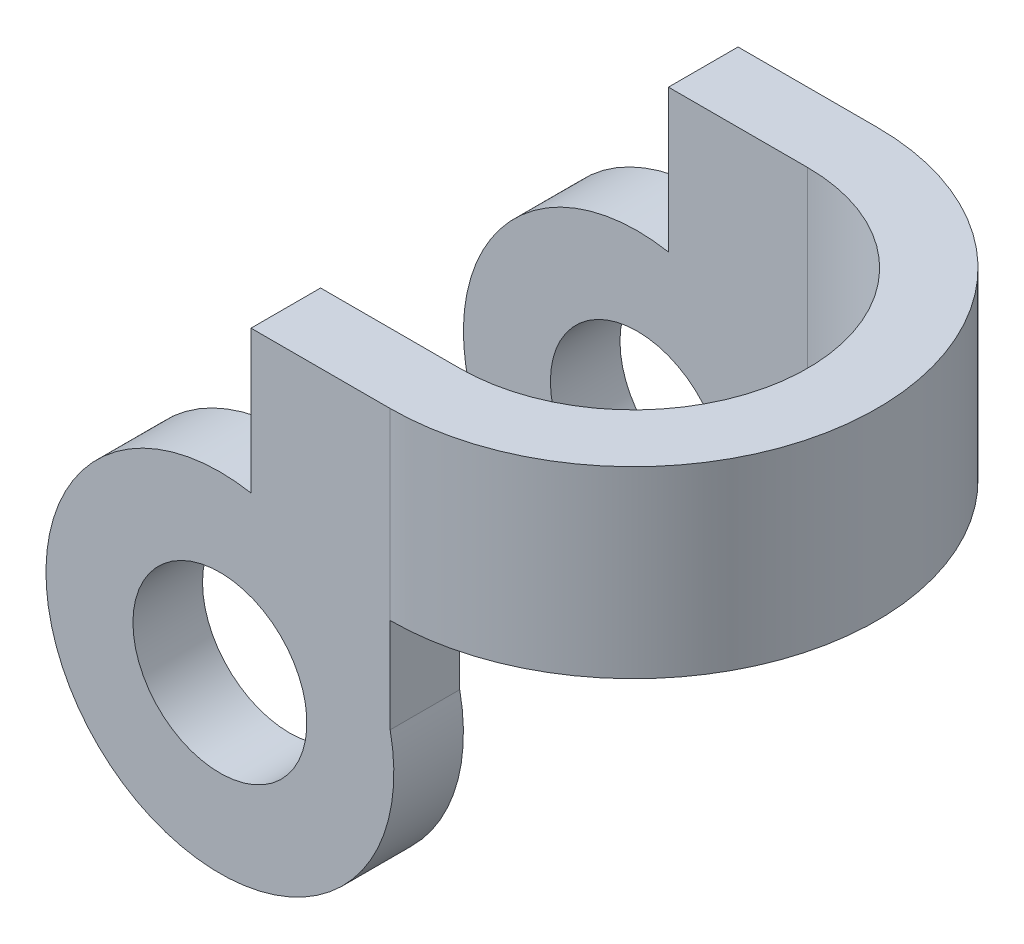
ISO-10303-21;
HEADER;
FILE_DESCRIPTION(('STEP AP214'),'2;1');
FILE_NAME('part.step','',(''),(''),'','','');
FILE_SCHEMA(('AUTOMOTIVE_DESIGN { 1 0 10303 214 1 1 1 1 }'));
ENDSEC;
DATA;
#1=APPLICATION_CONTEXT('core data for automotive mechanical design processes');
#2=APPLICATION_PROTOCOL_DEFINITION('international standard','automotive_design',2000,#1);
#3=PRODUCT_CONTEXT('',#1,'mechanical');
#4=PRODUCT('Part','Part','',(#3));
#5=PRODUCT_RELATED_PRODUCT_CATEGORY('part','',(#4));
#6=PRODUCT_DEFINITION_FORMATION('','',#4);
#7=PRODUCT_DEFINITION_CONTEXT('part definition',#1,'design');
#8=PRODUCT_DEFINITION('design','',#6,#7);
#9=PRODUCT_DEFINITION_SHAPE('','',#8);
#10=(LENGTH_UNIT() NAMED_UNIT(*) SI_UNIT(.MILLI.,.METRE.));
#11=(NAMED_UNIT(*) PLANE_ANGLE_UNIT() SI_UNIT($,.RADIAN.));
#12=(NAMED_UNIT(*) SI_UNIT($,.STERADIAN.) SOLID_ANGLE_UNIT());
#13=UNCERTAINTY_MEASURE_WITH_UNIT(LENGTH_MEASURE(1.E-05),#10,'distance_accuracy_value','');
#14=(GEOMETRIC_REPRESENTATION_CONTEXT(3) GLOBAL_UNCERTAINTY_ASSIGNED_CONTEXT((#13)) GLOBAL_UNIT_ASSIGNED_CONTEXT((#10,
#11,#12)) REPRESENTATION_CONTEXT('',''));
#15=CARTESIAN_POINT('',(0.,0.,0.));
#16=DIRECTION('',(0.,0.,1.));
#17=DIRECTION('',(1.,0.,0.));
#18=AXIS2_PLACEMENT_3D('',#15,#16,#17);
#19=CARTESIAN_POINT('',(12.2353311810215,2.55864630043368,0.));
#20=DIRECTION('',(1.,0.,0.));
#21=DIRECTION('',(0.,0.,-1.));
#22=AXIS2_PLACEMENT_3D('',#19,#20,#21);
#23=PLANE('',#22);
#24=DIRECTION('',(0.,1.,0.));
#25=VECTOR('',#24,1.);
#26=CARTESIAN_POINT('',(12.2353311810215,2.55864630043368,0.));
#27=LINE('',#26,#25);
#28=CARTESIAN_POINT('',(12.2353311810215,2.55864630043368,0.));
#29=VERTEX_POINT('',#28);
#30=CARTESIAN_POINT('',(12.2353311810215,9.36286384119889,0.));
#31=VERTEX_POINT('',#30);
#32=EDGE_CURVE('E223',#29,#31,#27,.T.);
#33=ORIENTED_EDGE('',*,*,#32,.T.);
#34=DIRECTION('',(0.,0.,1.));
#35=VECTOR('',#34,1.);
#36=CARTESIAN_POINT('',(12.2353311810215,9.36286384119889,0.));
#37=LINE('',#36,#35);
#38=CARTESIAN_POINT('',(12.2353311810215,9.36286384119889,5.));
#39=VERTEX_POINT('',#38);
#40=EDGE_CURVE('E64',#39,#31,#37,.F.);
#41=ORIENTED_EDGE('',*,*,#40,.F.);
#42=DIRECTION('',(0.,1.,0.));
#43=VECTOR('',#42,1.);
#44=CARTESIAN_POINT('',(12.2353311810215,2.55864630043368,5.));
#45=LINE('',#44,#43);
#46=CARTESIAN_POINT('',(12.2353311810215,2.55864630043368,5.));
#47=VERTEX_POINT('',#46);
#48=EDGE_CURVE('E222',#47,#39,#45,.T.);
#49=ORIENTED_EDGE('',*,*,#48,.F.);
#50=DIRECTION('',(0.,0.,1.));
#51=VECTOR('',#50,1.);
#52=CARTESIAN_POINT('',(12.2353311810215,2.55864630043368,0.));
#53=LINE('',#52,#51);
#54=EDGE_CURVE('E243',#29,#47,#53,.T.);
#55=ORIENTED_EDGE('',*,*,#54,.F.);
#56=EDGE_LOOP('',(#33,#41,#49,#55));
#57=FACE_BOUND('',#56,.T.);
#58=ADVANCED_FACE('F41',(#57),#23,.T.);
#59=CARTESIAN_POINT('',(0.,0.,5.));
#60=DIRECTION('',(0.,0.,-1.));
#61=DIRECTION('',(-1.,0.,0.));
#62=AXIS2_PLACEMENT_3D('',#59,#60,#61);
#63=CYLINDRICAL_SURFACE('',#62,12.5);
#64=CARTESIAN_POINT('',(0.,0.,0.));
#65=DIRECTION('',(0.,0.,1.));
#66=DIRECTION('',(1.,0.,0.));
#67=AXIS2_PLACEMENT_3D('',#64,#65,#66);
#68=CIRCLE('',#67,12.5);
#69=CARTESIAN_POINT('',(2.2353311810215,12.2985078164448,0.));
#70=VERTEX_POINT('',#69);
#71=EDGE_CURVE('E45',#70,#29,#68,.T.);
#72=ORIENTED_EDGE('',*,*,#71,.T.);
#73=ORIENTED_EDGE('',*,*,#54,.T.);
#74=CARTESIAN_POINT('',(0.,0.,5.));
#75=DIRECTION('',(0.,0.,1.));
#76=DIRECTION('',(1.,0.,0.));
#77=AXIS2_PLACEMENT_3D('',#74,#75,#76);
#78=CIRCLE('',#77,12.5);
#79=CARTESIAN_POINT('',(2.2353311810215,12.2985078164448,5.));
#80=VERTEX_POINT('',#79);
#81=EDGE_CURVE('E11',#80,#47,#78,.T.);
#82=ORIENTED_EDGE('',*,*,#81,.F.);
#83=DIRECTION('',(0.,0.,-1.));
#84=VECTOR('',#83,1.);
#85=CARTESIAN_POINT('',(2.2353311810215,12.2985078164448,5.));
#86=LINE('',#85,#84);
#87=EDGE_CURVE('E247',#80,#70,#86,.T.);
#88=ORIENTED_EDGE('',*,*,#87,.T.);
#89=EDGE_LOOP('',(#72,#73,#82,#88));
#90=FACE_BOUND('',#89,.T.);
#91=ADVANCED_FACE('F43',(#90),#63,.T.);
#92=CARTESIAN_POINT('',(0.,0.,5.));
#93=DIRECTION('',(0.,0.,1.));
#94=DIRECTION('',(1.,0.,0.));
#95=AXIS2_PLACEMENT_3D('',#92,#93,#94);
#96=PLANE('',#95);
#97=CARTESIAN_POINT('',(0.,0.,5.));
#98=DIRECTION('',(0.,0.,1.));
#99=DIRECTION('',(1.,0.,0.));
#100=AXIS2_PLACEMENT_3D('',#97,#98,#99);
#101=CIRCLE('',#100,6.25);
#102=CARTESIAN_POINT('',(6.25,0.,5.));
#103=VERTEX_POINT('',#102);
#104=EDGE_CURVE('E218',#103,#103,#101,.T.);
#105=ORIENTED_EDGE('',*,*,#104,.F.);
#106=EDGE_LOOP('',(#105));
#107=FACE_BOUND('',#106,.T.);
#108=ORIENTED_EDGE('',*,*,#81,.T.);
#109=ORIENTED_EDGE('',*,*,#48,.T.);
#110=DIRECTION('',(0.,-1.,0.));
#111=VECTOR('',#110,1.);
#112=CARTESIAN_POINT('',(12.2353311810215,22.5586463004337,5.));
#113=LINE('',#112,#111);
#114=CARTESIAN_POINT('',(12.2353311810215,22.5586463004337,5.));
#115=VERTEX_POINT('',#114);
#116=EDGE_CURVE('E186',#115,#39,#113,.T.);
#117=ORIENTED_EDGE('',*,*,#116,.F.);
#118=DIRECTION('',(-1.,0.,0.));
#119=VECTOR('',#118,1.);
#120=CARTESIAN_POINT('',(12.2353311810215,22.5586463004337,5.));
#121=LINE('',#120,#119);
#122=CARTESIAN_POINT('',(2.2353311810215,22.5586463004337,5.));
#123=VERTEX_POINT('',#122);
#124=EDGE_CURVE('E237',#115,#123,#121,.T.);
#125=ORIENTED_EDGE('',*,*,#124,.T.);
#126=DIRECTION('',(0.,-1.,0.));
#127=VECTOR('',#126,1.);
#128=CARTESIAN_POINT('',(2.2353311810215,2.55864630043368,5.));
#129=LINE('',#128,#127);
#130=EDGE_CURVE('E227',#123,#80,#129,.T.);
#131=ORIENTED_EDGE('',*,*,#130,.T.);
#132=EDGE_LOOP('',(#108,#109,#117,#125,#131));
#133=FACE_BOUND('',#132,.T.);
#134=ADVANCED_FACE('F271',(#107,#133),#96,.T.);
#135=CARTESIAN_POINT('',(0.,0.,0.));
#136=DIRECTION('',(0.,0.,1.));
#137=DIRECTION('',(1.,0.,0.));
#138=AXIS2_PLACEMENT_3D('',#135,#136,#137);
#139=PLANE('',#138);
#140=CARTESIAN_POINT('',(0.,0.,0.));
#141=DIRECTION('',(0.,0.,-1.));
#142=DIRECTION('',(-1.,0.,0.));
#143=AXIS2_PLACEMENT_3D('',#140,#141,#142);
#144=CIRCLE('',#143,6.25);
#145=CARTESIAN_POINT('',(-6.25,0.,0.));
#146=VERTEX_POINT('',#145);
#147=EDGE_CURVE('E214',#146,#146,#144,.T.);
#148=ORIENTED_EDGE('',*,*,#147,.F.);
#149=EDGE_LOOP('',(#148));
#150=FACE_BOUND('',#149,.T.);
#151=ORIENTED_EDGE('',*,*,#71,.F.);
#152=DIRECTION('',(0.,-1.,0.));
#153=VECTOR('',#152,1.);
#154=CARTESIAN_POINT('',(2.2353311810215,2.55864630043368,0.));
#155=LINE('',#154,#153);
#156=CARTESIAN_POINT('',(2.2353311810215,22.5586463004337,0.));
#157=VERTEX_POINT('',#156);
#158=EDGE_CURVE('E231',#157,#70,#155,.T.);
#159=ORIENTED_EDGE('',*,*,#158,.F.);
#160=DIRECTION('',(-1.,0.,0.));
#161=VECTOR('',#160,1.);
#162=CARTESIAN_POINT('',(12.2353311810215,22.5586463004337,0.));
#163=LINE('',#162,#161);
#164=CARTESIAN_POINT('',(12.2353311810215,22.5586463004337,0.));
#165=VERTEX_POINT('',#164);
#166=EDGE_CURVE('E226',#165,#157,#163,.T.);
#167=ORIENTED_EDGE('',*,*,#166,.F.);
#168=DIRECTION('',(0.,-1.,0.));
#169=VECTOR('',#168,1.);
#170=CARTESIAN_POINT('',(12.2353311810215,22.5586463004337,0.));
#171=LINE('',#170,#169);
#172=EDGE_CURVE('E57',#31,#165,#171,.F.);
#173=ORIENTED_EDGE('',*,*,#172,.F.);
#174=ORIENTED_EDGE('',*,*,#32,.F.);
#175=EDGE_LOOP('',(#151,#159,#167,#173,#174));
#176=FACE_BOUND('',#175,.T.);
#177=ADVANCED_FACE('F259',(#150,#176),#139,.F.);
#178=CARTESIAN_POINT('',(2.2353311810215,2.55864630043368,0.));
#179=DIRECTION('',(-1.,0.,0.));
#180=DIRECTION('',(0.,0.,1.));
#181=AXIS2_PLACEMENT_3D('',#178,#179,#180);
#182=PLANE('',#181);
#183=ORIENTED_EDGE('',*,*,#87,.F.);
#184=ORIENTED_EDGE('',*,*,#130,.F.);
#185=DIRECTION('',(0.,0.,1.));
#186=VECTOR('',#185,1.);
#187=CARTESIAN_POINT('',(2.2353311810215,22.5586463004337,0.));
#188=LINE('',#187,#186);
#189=EDGE_CURVE('E234',#157,#123,#188,.T.);
#190=ORIENTED_EDGE('',*,*,#189,.F.);
#191=ORIENTED_EDGE('',*,*,#158,.T.);
#192=EDGE_LOOP('',(#183,#184,#190,#191));
#193=FACE_BOUND('',#192,.T.);
#194=ADVANCED_FACE('F269',(#193),#182,.T.);
#195=CARTESIAN_POINT('',(12.2353311810215,22.5586463004337,0.));
#196=DIRECTION('',(0.,1.,0.));
#197=DIRECTION('',(-1.,0.,0.));
#198=AXIS2_PLACEMENT_3D('',#195,#196,#197);
#199=PLANE('',#198);
#200=ORIENTED_EDGE('',*,*,#124,.F.);
#201=CARTESIAN_POINT('',(12.2353311810215,22.5586463004337,17.5));
#202=DIRECTION('',(0.,1.,0.));
#203=DIRECTION('',(0.,0.,1.));
#204=AXIS2_PLACEMENT_3D('',#201,#202,#203);
#205=CIRCLE('',#204,12.5);
#206=CARTESIAN_POINT('',(12.2353311810215,22.5586463004337,30.));
#207=VERTEX_POINT('',#206);
#208=EDGE_CURVE('E191',#207,#115,#205,.T.);
#209=ORIENTED_EDGE('',*,*,#208,.F.);
#210=DIRECTION('',(1.,0.,0.));
#211=VECTOR('',#210,1.);
#212=CARTESIAN_POINT('',(12.2353311810215,22.5586463004337,30.));
#213=LINE('',#212,#211);
#214=CARTESIAN_POINT('',(2.2353311810215,22.5586463004337,30.));
#215=VERTEX_POINT('',#214);
#216=EDGE_CURVE('E143',#215,#207,#213,.T.);
#217=ORIENTED_EDGE('',*,*,#216,.F.);
#218=DIRECTION('',(0.,0.,-1.));
#219=VECTOR('',#218,1.);
#220=CARTESIAN_POINT('',(2.2353311810215,22.5586463004337,35.));
#221=LINE('',#220,#219);
#222=CARTESIAN_POINT('',(2.2353311810215,22.5586463004337,35.));
#223=VERTEX_POINT('',#222);
#224=EDGE_CURVE('E125',#223,#215,#221,.T.);
#225=ORIENTED_EDGE('',*,*,#224,.F.);
#226=DIRECTION('',(1.,0.,0.));
#227=VECTOR('',#226,1.);
#228=CARTESIAN_POINT('',(12.2353311810215,22.5586463004337,35.));
#229=LINE('',#228,#227);
#230=CARTESIAN_POINT('',(12.2353311810215,22.5586463004337,35.));
#231=VERTEX_POINT('',#230);
#232=EDGE_CURVE('E133',#223,#231,#229,.T.);
#233=ORIENTED_EDGE('',*,*,#232,.T.);
#234=CARTESIAN_POINT('',(12.2353311810215,22.5586463004337,17.5));
#235=DIRECTION('',(0.,1.,0.));
#236=DIRECTION('',(0.,0.,1.));
#237=AXIS2_PLACEMENT_3D('',#234,#235,#236);
#238=CIRCLE('',#237,17.5);
#239=EDGE_CURVE('E211',#231,#165,#238,.T.);
#240=ORIENTED_EDGE('',*,*,#239,.T.);
#241=ORIENTED_EDGE('',*,*,#166,.T.);
#242=ORIENTED_EDGE('',*,*,#189,.T.);
#243=EDGE_LOOP('',(#200,#209,#217,#225,#233,#240,#241,#242));
#244=FACE_BOUND('',#243,.T.);
#245=ADVANCED_FACE('F138',(#244),#199,.T.);
#246=CARTESIAN_POINT('',(0.,0.,35.));
#247=DIRECTION('',(0.,0.,-1.));
#248=DIRECTION('',(-1.,0.,0.));
#249=AXIS2_PLACEMENT_3D('',#246,#247,#248);
#250=CYLINDRICAL_SURFACE('',#249,6.25);
#251=ORIENTED_EDGE('',*,*,#104,.T.);
#252=EDGE_LOOP('',(#251));
#253=FACE_BOUND('',#252,.T.);
#254=ORIENTED_EDGE('',*,*,#147,.T.);
#255=EDGE_LOOP('',(#254));
#256=FACE_BOUND('',#255,.T.);
#257=ADVANCED_FACE('F290',(#253,#256),#250,.F.);
#258=CARTESIAN_POINT('',(12.2353311810215,15.9607550708163,17.5));
#259=DIRECTION('',(0.,1.,0.));
#260=DIRECTION('',(0.,0.,1.));
#261=AXIS2_PLACEMENT_3D('',#258,#259,#260);
#262=CYLINDRICAL_SURFACE('',#261,12.5);
#263=CARTESIAN_POINT('',(12.2353311810215,9.36286384119889,17.5));
#264=DIRECTION('',(0.,1.,0.));
#265=DIRECTION('',(0.,0.,1.));
#266=AXIS2_PLACEMENT_3D('',#263,#264,#265);
#267=CIRCLE('',#266,12.5);
#268=CARTESIAN_POINT('',(12.2353311810215,9.36286384119889,30.));
#269=VERTEX_POINT('',#268);
#270=EDGE_CURVE('E190',#269,#39,#267,.T.);
#271=ORIENTED_EDGE('',*,*,#270,.F.);
#272=DIRECTION('',(0.,-1.,0.));
#273=VECTOR('',#272,1.);
#274=CARTESIAN_POINT('',(12.2353311810215,22.5586463004337,30.));
#275=LINE('',#274,#273);
#276=EDGE_CURVE('E174',#207,#269,#275,.T.);
#277=ORIENTED_EDGE('',*,*,#276,.F.);
#278=ORIENTED_EDGE('',*,*,#208,.T.);
#279=ORIENTED_EDGE('',*,*,#116,.T.);
#280=EDGE_LOOP('',(#271,#277,#278,#279));
#281=FACE_BOUND('',#280,.T.);
#282=ADVANCED_FACE('F273',(#281),#262,.F.);
#283=CARTESIAN_POINT('',(12.2353311810215,9.36286384119889,35.));
#284=DIRECTION('',(0.,1.,0.));
#285=DIRECTION('',(0.,0.,1.));
#286=AXIS2_PLACEMENT_3D('',#283,#284,#285);
#287=PLANE('',#286);
#288=CARTESIAN_POINT('',(12.2353311810215,9.36286384119889,17.5));
#289=DIRECTION('',(0.,1.,0.));
#290=DIRECTION('',(0.,0.,1.));
#291=AXIS2_PLACEMENT_3D('',#288,#289,#290);
#292=CIRCLE('',#291,17.5);
#293=CARTESIAN_POINT('',(12.2353311810215,9.36286384119889,35.));
#294=VERTEX_POINT('',#293);
#295=EDGE_CURVE('E203',#294,#31,#292,.T.);
#296=ORIENTED_EDGE('',*,*,#295,.F.);
#297=DIRECTION('',(0.,0.,-1.));
#298=VECTOR('',#297,1.);
#299=CARTESIAN_POINT('',(12.2353311810215,9.36286384119889,35.));
#300=LINE('',#299,#298);
#301=EDGE_CURVE('E185',#269,#294,#300,.F.);
#302=ORIENTED_EDGE('',*,*,#301,.F.);
#303=ORIENTED_EDGE('',*,*,#270,.T.);
#304=ORIENTED_EDGE('',*,*,#40,.T.);
#305=EDGE_LOOP('',(#296,#302,#303,#304));
#306=FACE_BOUND('',#305,.T.);
#307=ADVANCED_FACE('F262',(#306),#287,.F.);
#308=CARTESIAN_POINT('',(12.2353311810215,15.9607550708163,17.5));
#309=DIRECTION('',(0.,1.,0.));
#310=DIRECTION('',(0.,0.,1.));
#311=AXIS2_PLACEMENT_3D('',#308,#309,#310);
#312=CYLINDRICAL_SURFACE('',#311,17.5);
#313=ORIENTED_EDGE('',*,*,#239,.F.);
#314=DIRECTION('',(0.,-1.,0.));
#315=VECTOR('',#314,1.);
#316=CARTESIAN_POINT('',(12.2353311810215,22.5586463004337,35.));
#317=LINE('',#316,#315);
#318=EDGE_CURVE('E150',#294,#231,#317,.F.);
#319=ORIENTED_EDGE('',*,*,#318,.F.);
#320=ORIENTED_EDGE('',*,*,#295,.T.);
#321=ORIENTED_EDGE('',*,*,#172,.T.);
#322=EDGE_LOOP('',(#313,#319,#320,#321));
#323=FACE_BOUND('',#322,.T.);
#324=ADVANCED_FACE('F265',(#323),#312,.T.);
#325=CARTESIAN_POINT('',(12.2353311810215,2.55864630043368,35.));
#326=DIRECTION('',(1.,0.,0.));
#327=DIRECTION('',(0.,0.,-1.));
#328=AXIS2_PLACEMENT_3D('',#325,#326,#327);
#329=PLANE('',#328);
#330=ORIENTED_EDGE('',*,*,#301,.T.);
#331=DIRECTION('',(0.,-1.,0.));
#332=VECTOR('',#331,1.);
#333=CARTESIAN_POINT('',(12.2353311810215,2.55864630043368,35.));
#334=LINE('',#333,#332);
#335=CARTESIAN_POINT('',(12.2353311810215,2.55864630043369,35.));
#336=VERTEX_POINT('',#335);
#337=EDGE_CURVE('E146',#294,#336,#334,.T.);
#338=ORIENTED_EDGE('',*,*,#337,.T.);
#339=DIRECTION('',(0.,0.,-1.));
#340=VECTOR('',#339,1.);
#341=CARTESIAN_POINT('',(12.2353311810215,2.55864630043368,35.));
#342=LINE('',#341,#340);
#343=CARTESIAN_POINT('',(12.2353311810215,2.55864630043369,30.));
#344=VERTEX_POINT('',#343);
#345=EDGE_CURVE('E145',#336,#344,#342,.T.);
#346=ORIENTED_EDGE('',*,*,#345,.T.);
#347=DIRECTION('',(0.,-1.,0.));
#348=VECTOR('',#347,1.);
#349=CARTESIAN_POINT('',(12.2353311810215,2.55864630043368,30.));
#350=LINE('',#349,#348);
#351=EDGE_CURVE('E134',#269,#344,#350,.T.);
#352=ORIENTED_EDGE('',*,*,#351,.F.);
#353=EDGE_LOOP('',(#330,#338,#346,#352));
#354=FACE_BOUND('',#353,.T.);
#355=ADVANCED_FACE('F281',(#354),#329,.T.);
#356=CARTESIAN_POINT('',(0.,0.,35.));
#357=DIRECTION('',(0.,0.,-1.));
#358=DIRECTION('',(-1.,0.,0.));
#359=AXIS2_PLACEMENT_3D('',#356,#357,#358);
#360=CYLINDRICAL_SURFACE('',#359,12.5);
#361=CARTESIAN_POINT('',(0.,0.,30.));
#362=DIRECTION('',(0.,0.,1.));
#363=DIRECTION('',(1.,0.,0.));
#364=AXIS2_PLACEMENT_3D('',#361,#362,#363);
#365=CIRCLE('',#364,12.5);
#366=CARTESIAN_POINT('',(2.2353311810215,12.2985078164448,30.));
#367=VERTEX_POINT('',#366);
#368=EDGE_CURVE('E170',#367,#344,#365,.T.);
#369=ORIENTED_EDGE('',*,*,#368,.T.);
#370=ORIENTED_EDGE('',*,*,#345,.F.);
#371=CARTESIAN_POINT('',(0.,0.,35.));
#372=DIRECTION('',(0.,0.,1.));
#373=DIRECTION('',(1.,0.,0.));
#374=AXIS2_PLACEMENT_3D('',#371,#372,#373);
#375=CIRCLE('',#374,12.5);
#376=CARTESIAN_POINT('',(2.2353311810215,12.2985078164448,35.));
#377=VERTEX_POINT('',#376);
#378=EDGE_CURVE('E171',#377,#336,#375,.T.);
#379=ORIENTED_EDGE('',*,*,#378,.F.);
#380=DIRECTION('',(0.,0.,-1.));
#381=VECTOR('',#380,1.);
#382=CARTESIAN_POINT('',(2.2353311810215,12.2985078164448,35.));
#383=LINE('',#382,#381);
#384=EDGE_CURVE('E128',#377,#367,#383,.T.);
#385=ORIENTED_EDGE('',*,*,#384,.T.);
#386=EDGE_LOOP('',(#369,#370,#379,#385));
#387=FACE_BOUND('',#386,.T.);
#388=ADVANCED_FACE('F279',(#387),#360,.T.);
#389=CARTESIAN_POINT('',(0.,0.,35.));
#390=DIRECTION('',(0.,0.,1.));
#391=DIRECTION('',(1.,0.,0.));
#392=AXIS2_PLACEMENT_3D('',#389,#390,#391);
#393=PLANE('',#392);
#394=CARTESIAN_POINT('',(0.,0.,35.));
#395=DIRECTION('',(0.,0.,-1.));
#396=DIRECTION('',(-1.,0.,0.));
#397=AXIS2_PLACEMENT_3D('',#394,#395,#396);
#398=CIRCLE('',#397,6.25);
#399=CARTESIAN_POINT('',(-6.25,0.,35.));
#400=VERTEX_POINT('',#399);
#401=EDGE_CURVE('E181',#400,#400,#398,.T.);
#402=ORIENTED_EDGE('',*,*,#401,.T.);
#403=EDGE_LOOP('',(#402));
#404=FACE_BOUND('',#403,.T.);
#405=ORIENTED_EDGE('',*,*,#378,.T.);
#406=ORIENTED_EDGE('',*,*,#337,.F.);
#407=ORIENTED_EDGE('',*,*,#318,.T.);
#408=ORIENTED_EDGE('',*,*,#232,.F.);
#409=DIRECTION('',(0.,1.,0.));
#410=VECTOR('',#409,1.);
#411=CARTESIAN_POINT('',(2.2353311810215,22.5586463004337,35.));
#412=LINE('',#411,#410);
#413=EDGE_CURVE('E121',#377,#223,#412,.T.);
#414=ORIENTED_EDGE('',*,*,#413,.F.);
#415=EDGE_LOOP('',(#405,#406,#407,#408,#414));
#416=FACE_BOUND('',#415,.T.);
#417=ADVANCED_FACE('F148',(#404,#416),#393,.T.);
#418=CARTESIAN_POINT('',(0.,0.,30.));
#419=DIRECTION('',(0.,0.,1.));
#420=DIRECTION('',(1.,0.,0.));
#421=AXIS2_PLACEMENT_3D('',#418,#419,#420);
#422=PLANE('',#421);
#423=CARTESIAN_POINT('',(0.,0.,30.));
#424=DIRECTION('',(0.,0.,1.));
#425=DIRECTION('',(1.,0.,0.));
#426=AXIS2_PLACEMENT_3D('',#423,#424,#425);
#427=CIRCLE('',#426,6.25);
#428=CARTESIAN_POINT('',(6.25,0.,30.));
#429=VERTEX_POINT('',#428);
#430=EDGE_CURVE('E160',#429,#429,#427,.T.);
#431=ORIENTED_EDGE('',*,*,#430,.T.);
#432=EDGE_LOOP('',(#431));
#433=FACE_BOUND('',#432,.T.);
#434=ORIENTED_EDGE('',*,*,#368,.F.);
#435=DIRECTION('',(0.,1.,0.));
#436=VECTOR('',#435,1.);
#437=CARTESIAN_POINT('',(2.2353311810215,22.5586463004337,30.));
#438=LINE('',#437,#436);
#439=EDGE_CURVE('E157',#367,#215,#438,.T.);
#440=ORIENTED_EDGE('',*,*,#439,.T.);
#441=ORIENTED_EDGE('',*,*,#216,.T.);
#442=ORIENTED_EDGE('',*,*,#276,.T.);
#443=ORIENTED_EDGE('',*,*,#351,.T.);
#444=EDGE_LOOP('',(#434,#440,#441,#442,#443));
#445=FACE_BOUND('',#444,.T.);
#446=ADVANCED_FACE('F275',(#433,#445),#422,.F.);
#447=CARTESIAN_POINT('',(2.2353311810215,22.5586463004337,35.));
#448=DIRECTION('',(-1.,0.,0.));
#449=DIRECTION('',(0.,0.,1.));
#450=AXIS2_PLACEMENT_3D('',#447,#448,#449);
#451=PLANE('',#450);
#452=ORIENTED_EDGE('',*,*,#384,.F.);
#453=ORIENTED_EDGE('',*,*,#413,.T.);
#454=ORIENTED_EDGE('',*,*,#224,.T.);
#455=ORIENTED_EDGE('',*,*,#439,.F.);
#456=EDGE_LOOP('',(#452,#453,#454,#455));
#457=FACE_BOUND('',#456,.T.);
#458=ADVANCED_FACE('F123',(#457),#451,.T.);
#459=CARTESIAN_POINT('',(0.,0.,35.));
#460=DIRECTION('',(0.,0.,-1.));
#461=DIRECTION('',(-1.,0.,0.));
#462=AXIS2_PLACEMENT_3D('',#459,#460,#461);
#463=CYLINDRICAL_SURFACE('',#462,6.25);
#464=ORIENTED_EDGE('',*,*,#401,.F.);
#465=EDGE_LOOP('',(#464));
#466=FACE_BOUND('',#465,.T.);
#467=ORIENTED_EDGE('',*,*,#430,.F.);
#468=EDGE_LOOP('',(#467));
#469=FACE_BOUND('',#468,.T.);
#470=ADVANCED_FACE('F327',(#466,#469),#463,.F.);
#471=CLOSED_SHELL('',(#58,#91,#134,#177,#194,#245,#257,#282,#307,#324,#355,#388,#417,#446,#458,#470));
#472=MANIFOLD_SOLID_BREP('B2',#471);
#473=ADVANCED_BREP_SHAPE_REPRESENTATION('',(#18,#472),#14);
#474=SHAPE_DEFINITION_REPRESENTATION(#9,#473);
ENDSEC;
END-ISO-10303-21;
